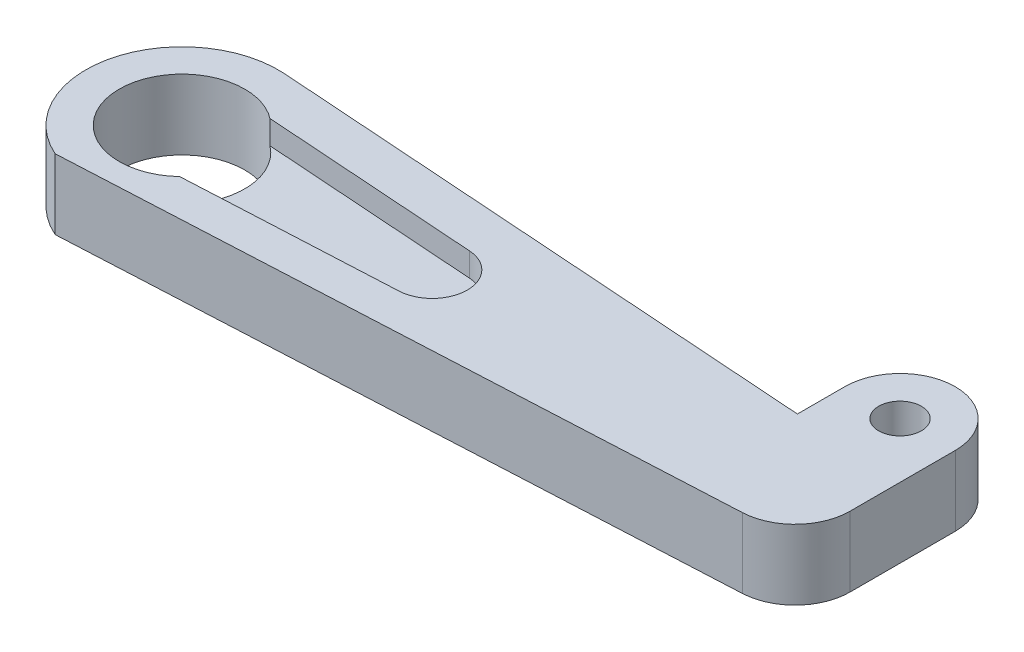
ISO-10303-21;
HEADER;
FILE_DESCRIPTION(('STEP AP214'),'2;1');
FILE_NAME('part.step','',(''),(''),'','','');
FILE_SCHEMA(('AUTOMOTIVE_DESIGN { 1 0 10303 214 1 1 1 1 }'));
ENDSEC;
DATA;
#1=APPLICATION_CONTEXT('core data for automotive mechanical design processes');
#2=APPLICATION_PROTOCOL_DEFINITION('international standard','automotive_design',2000,#1);
#3=PRODUCT_CONTEXT('',#1,'mechanical');
#4=PRODUCT('Part','Part','',(#3));
#5=PRODUCT_RELATED_PRODUCT_CATEGORY('part','',(#4));
#6=PRODUCT_DEFINITION_FORMATION('','',#4);
#7=PRODUCT_DEFINITION_CONTEXT('part definition',#1,'design');
#8=PRODUCT_DEFINITION('design','',#6,#7);
#9=PRODUCT_DEFINITION_SHAPE('','',#8);
#10=(LENGTH_UNIT() NAMED_UNIT(*) SI_UNIT(.MILLI.,.METRE.));
#11=(NAMED_UNIT(*) PLANE_ANGLE_UNIT() SI_UNIT($,.RADIAN.));
#12=(NAMED_UNIT(*) SI_UNIT($,.STERADIAN.) SOLID_ANGLE_UNIT());
#13=UNCERTAINTY_MEASURE_WITH_UNIT(LENGTH_MEASURE(1.E-05),#10,'distance_accuracy_value','');
#14=(GEOMETRIC_REPRESENTATION_CONTEXT(3) GLOBAL_UNCERTAINTY_ASSIGNED_CONTEXT((#13)) GLOBAL_UNIT_ASSIGNED_CONTEXT((#10,
#11,#12)) REPRESENTATION_CONTEXT('',''));
#15=CARTESIAN_POINT('',(0.,0.,0.));
#16=DIRECTION('',(0.,0.,1.));
#17=DIRECTION('',(1.,0.,0.));
#18=AXIS2_PLACEMENT_3D('',#15,#16,#17);
#19=CARTESIAN_POINT('',(0.,4.,0.));
#20=DIRECTION('',(0.,1.,0.));
#21=DIRECTION('',(0.,0.,1.));
#22=AXIS2_PLACEMENT_3D('',#19,#20,#21);
#23=PLANE('',#22);
#24=CARTESIAN_POINT('',(0.,4.,0.));
#25=DIRECTION('',(0.,-1.,0.));
#26=DIRECTION('',(0.,0.,-1.));
#27=AXIS2_PLACEMENT_3D('',#24,#25,#26);
#28=CIRCLE('',#27,3.585);
#29=CARTESIAN_POINT('',(2.46824330243191,4.,2.6));
#30=VERTEX_POINT('',#29);
#31=CARTESIAN_POINT('',(2.17479309360684,4.,-2.85));
#32=VERTEX_POINT('',#31);
#33=EDGE_CURVE('E184',#30,#32,#28,.T.);
#34=ORIENTED_EDGE('',*,*,#33,.T.);
#35=DIRECTION('',(-0.997596457520769,0.,-0.0692914709182375));
#36=VECTOR('',#35,1.);
#37=CARTESIAN_POINT('',(2.17479309360684,4.,-2.85));
#38=LINE('',#37,#36);
#39=CARTESIAN_POINT('',(14.4288371997458,4.,-1.99885349240161));
#40=VERTEX_POINT('',#39);
#41=EDGE_CURVE('E203',#40,#32,#38,.T.);
#42=ORIENTED_EDGE('',*,*,#41,.F.);
#43=CARTESIAN_POINT('',(14.29,4.,0.));
#44=DIRECTION('',(0.,1.,0.));
#45=DIRECTION('',(0.,0.,-1.));
#46=AXIS2_PLACEMENT_3D('',#43,#44,#45);
#47=CIRCLE('',#46,2.00366939691142);
#48=CARTESIAN_POINT('',(14.3905171987579,4.,2.00114650759839));
#49=VERTEX_POINT('',#48);
#50=EDGE_CURVE('E208',#49,#40,#47,.T.);
#51=ORIENTED_EDGE('',*,*,#50,.F.);
#52=DIRECTION('',(0.998740865475654,0.,-0.0501665588708387));
#53=VECTOR('',#52,1.);
#54=CARTESIAN_POINT('',(14.3905171987579,4.,2.00114650759839));
#55=LINE('',#54,#53);
#56=EDGE_CURVE('E211',#30,#49,#55,.T.);
#57=ORIENTED_EDGE('',*,*,#56,.F.);
#58=EDGE_LOOP('',(#34,#42,#51,#57));
#59=FACE_BOUND('',#58,.T.);
#60=CARTESIAN_POINT('',(0.,4.,0.));
#61=DIRECTION('',(0.,1.,0.));
#62=DIRECTION('',(0.,0.,1.));
#63=AXIS2_PLACEMENT_3D('',#60,#61,#62);
#64=CIRCLE('',#63,5.49384451633303);
#65=CARTESIAN_POINT('',(0.380676567532808,4.,-5.48063982766373));
#66=VERTEX_POINT('',#65);
#67=CARTESIAN_POINT('',(-2.21545485276915,4.,5.0273340216246));
#68=VERTEX_POINT('',#67);
#69=EDGE_CURVE('E156',#66,#68,#64,.T.);
#70=ORIENTED_EDGE('',*,*,#69,.T.);
#71=DIRECTION('',(0.998740865475654,0.,-0.0501665588708389));
#72=VECTOR('',#71,1.);
#73=CARTESIAN_POINT('',(35.1582269633634,4.,3.15006127364699));
#74=LINE('',#73,#72);
#75=CARTESIAN_POINT('',(35.1582269633634,4.,3.15006127364699));
#76=VERTEX_POINT('',#75);
#77=EDGE_CURVE('E101',#68,#76,#74,.T.);
#78=ORIENTED_EDGE('',*,*,#77,.T.);
#79=CARTESIAN_POINT('',(35.,4.,0.));
#80=DIRECTION('',(0.,1.,0.));
#81=DIRECTION('',(0.,0.,1.));
#82=AXIS2_PLACEMENT_3D('',#79,#80,#81);
#83=CIRCLE('',#82,3.15403262501606);
#84=CARTESIAN_POINT('',(38.1540326250161,4.,0.));
#85=VERTEX_POINT('',#84);
#86=EDGE_CURVE('E168',#76,#85,#83,.T.);
#87=ORIENTED_EDGE('',*,*,#86,.T.);
#88=DIRECTION('',(0.,0.,-1.));
#89=VECTOR('',#88,1.);
#90=CARTESIAN_POINT('',(38.1540326250161,4.,-6.));
#91=LINE('',#90,#89);
#92=CARTESIAN_POINT('',(38.1540326250161,4.,-6.));
#93=VERTEX_POINT('',#92);
#94=EDGE_CURVE('E120',#85,#93,#91,.T.);
#95=ORIENTED_EDGE('',*,*,#94,.T.);
#96=CARTESIAN_POINT('',(35.,4.,-6.));
#97=DIRECTION('',(0.,1.,0.));
#98=DIRECTION('',(0.,0.,-1.));
#99=AXIS2_PLACEMENT_3D('',#96,#97,#98);
#100=CIRCLE('',#99,3.15403262501605);
#101=CARTESIAN_POINT('',(31.8459673749839,4.,-6.));
#102=VERTEX_POINT('',#101);
#103=EDGE_CURVE('E113',#93,#102,#100,.T.);
#104=ORIENTED_EDGE('',*,*,#103,.T.);
#105=DIRECTION('',(0.,0.,1.));
#106=VECTOR('',#105,1.);
#107=CARTESIAN_POINT('',(31.8459673749839,4.,-3.29511053224421));
#108=LINE('',#107,#106);
#109=CARTESIAN_POINT('',(31.8459673749839,4.,-3.29511053224421));
#110=VERTEX_POINT('',#109);
#111=EDGE_CURVE('E117',#102,#110,#108,.T.);
#112=ORIENTED_EDGE('',*,*,#111,.T.);
#113=DIRECTION('',(-0.997596457520769,0.,-0.0692914709182374));
#114=VECTOR('',#113,1.);
#115=CARTESIAN_POINT('',(0.380676567532808,4.,-5.48063982766373));
#116=LINE('',#115,#114);
#117=EDGE_CURVE('E63',#110,#66,#116,.T.);
#118=ORIENTED_EDGE('',*,*,#117,.T.);
#119=EDGE_LOOP('',(#70,#78,#87,#95,#104,#112,#118));
#120=FACE_BOUND('',#119,.T.);
#121=CARTESIAN_POINT('',(35.,4.,-6.));
#122=DIRECTION('',(0.,1.,0.));
#123=DIRECTION('',(0.,0.,1.));
#124=AXIS2_PLACEMENT_3D('',#121,#122,#123);
#125=CIRCLE('',#124,1.2192);
#126=CARTESIAN_POINT('',(35.,4.,-4.7808));
#127=VERTEX_POINT('',#126);
#128=EDGE_CURVE('E146',#127,#127,#125,.T.);
#129=ORIENTED_EDGE('',*,*,#128,.F.);
#130=EDGE_LOOP('',(#129));
#131=FACE_BOUND('',#130,.T.);
#132=ADVANCED_FACE('F39',(#59,#120,#131),#23,.T.);
#133=CARTESIAN_POINT('',(0.,0.,0.));
#134=DIRECTION('',(0.,1.,0.));
#135=DIRECTION('',(0.,0.,1.));
#136=AXIS2_PLACEMENT_3D('',#133,#134,#135);
#137=PLANE('',#136);
#138=CARTESIAN_POINT('',(0.,0.,0.));
#139=DIRECTION('',(0.,-1.,0.));
#140=DIRECTION('',(0.,0.,-1.));
#141=AXIS2_PLACEMENT_3D('',#138,#139,#140);
#142=CIRCLE('',#141,3.585);
#143=CARTESIAN_POINT('',(0.,0.,-3.585));
#144=VERTEX_POINT('',#143);
#145=EDGE_CURVE('E189',#144,#144,#142,.T.);
#146=ORIENTED_EDGE('',*,*,#145,.F.);
#147=EDGE_LOOP('',(#146));
#148=FACE_BOUND('',#147,.T.);
#149=CARTESIAN_POINT('',(0.,0.,0.));
#150=DIRECTION('',(0.,1.,0.));
#151=DIRECTION('',(0.,0.,1.));
#152=AXIS2_PLACEMENT_3D('',#149,#150,#151);
#153=CIRCLE('',#152,5.49384451633303);
#154=CARTESIAN_POINT('',(0.380676567532808,0.,-5.48063982766373));
#155=VERTEX_POINT('',#154);
#156=CARTESIAN_POINT('',(-2.21545485276915,0.,5.0273340216246));
#157=VERTEX_POINT('',#156);
#158=EDGE_CURVE('E142',#155,#157,#153,.T.);
#159=ORIENTED_EDGE('',*,*,#158,.F.);
#160=DIRECTION('',(-0.997596457520769,0.,-0.0692914709182374));
#161=VECTOR('',#160,1.);
#162=CARTESIAN_POINT('',(0.380676567532808,0.,-5.48063982766373));
#163=LINE('',#162,#161);
#164=CARTESIAN_POINT('',(31.8459673749839,0.,-3.29511053224421));
#165=VERTEX_POINT('',#164);
#166=EDGE_CURVE('E93',#165,#155,#163,.T.);
#167=ORIENTED_EDGE('',*,*,#166,.F.);
#168=DIRECTION('',(0.,0.,1.));
#169=VECTOR('',#168,1.);
#170=CARTESIAN_POINT('',(31.8459673749839,0.,-3.29511053224421));
#171=LINE('',#170,#169);
#172=CARTESIAN_POINT('',(31.8459673749839,0.,-6.));
#173=VERTEX_POINT('',#172);
#174=EDGE_CURVE('E153',#173,#165,#171,.T.);
#175=ORIENTED_EDGE('',*,*,#174,.F.);
#176=CARTESIAN_POINT('',(35.,0.,-6.));
#177=DIRECTION('',(0.,1.,0.));
#178=DIRECTION('',(0.,0.,-1.));
#179=AXIS2_PLACEMENT_3D('',#176,#177,#178);
#180=CIRCLE('',#179,3.15403262501605);
#181=CARTESIAN_POINT('',(38.1540326250161,0.,-6.));
#182=VERTEX_POINT('',#181);
#183=EDGE_CURVE('E129',#182,#173,#180,.T.);
#184=ORIENTED_EDGE('',*,*,#183,.F.);
#185=DIRECTION('',(0.,0.,-1.));
#186=VECTOR('',#185,1.);
#187=CARTESIAN_POINT('',(38.1540326250161,0.,-6.));
#188=LINE('',#187,#186);
#189=CARTESIAN_POINT('',(38.1540326250161,0.,0.));
#190=VERTEX_POINT('',#189);
#191=EDGE_CURVE('E150',#190,#182,#188,.T.);
#192=ORIENTED_EDGE('',*,*,#191,.F.);
#193=CARTESIAN_POINT('',(35.,0.,0.));
#194=DIRECTION('',(0.,1.,0.));
#195=DIRECTION('',(0.,0.,1.));
#196=AXIS2_PLACEMENT_3D('',#193,#194,#195);
#197=CIRCLE('',#196,3.15403262501606);
#198=CARTESIAN_POINT('',(35.1582269633634,0.,3.15006127364699));
#199=VERTEX_POINT('',#198);
#200=EDGE_CURVE('E148',#199,#190,#197,.T.);
#201=ORIENTED_EDGE('',*,*,#200,.F.);
#202=DIRECTION('',(0.998740865475654,0.,-0.0501665588708389));
#203=VECTOR('',#202,1.);
#204=CARTESIAN_POINT('',(35.1582269633634,0.,3.15006127364699));
#205=LINE('',#204,#203);
#206=EDGE_CURVE('E145',#157,#199,#205,.T.);
#207=ORIENTED_EDGE('',*,*,#206,.F.);
#208=EDGE_LOOP('',(#159,#167,#175,#184,#192,#201,#207));
#209=FACE_BOUND('',#208,.T.);
#210=CARTESIAN_POINT('',(35.,0.,-6.));
#211=DIRECTION('',(0.,1.,0.));
#212=DIRECTION('',(0.,0.,1.));
#213=AXIS2_PLACEMENT_3D('',#210,#211,#212);
#214=CIRCLE('',#213,1.2192);
#215=CARTESIAN_POINT('',(35.,0.,-4.7808));
#216=VERTEX_POINT('',#215);
#217=EDGE_CURVE('E181',#216,#216,#214,.T.);
#218=ORIENTED_EDGE('',*,*,#217,.T.);
#219=EDGE_LOOP('',(#218));
#220=FACE_BOUND('',#219,.T.);
#221=ADVANCED_FACE('F172',(#148,#209,#220),#137,.F.);
#222=CARTESIAN_POINT('',(0.,4.,0.));
#223=DIRECTION('',(0.,-1.,0.));
#224=DIRECTION('',(0.,0.,-1.));
#225=AXIS2_PLACEMENT_3D('',#222,#223,#224);
#226=CYLINDRICAL_SURFACE('',#225,5.49384451633303);
#227=ORIENTED_EDGE('',*,*,#158,.T.);
#228=DIRECTION('',(0.,-1.,0.));
#229=VECTOR('',#228,1.);
#230=CARTESIAN_POINT('',(-2.21545485276915,4.,5.0273340216246));
#231=LINE('',#230,#229);
#232=EDGE_CURVE('E11',#68,#157,#231,.T.);
#233=ORIENTED_EDGE('',*,*,#232,.F.);
#234=ORIENTED_EDGE('',*,*,#69,.F.);
#235=DIRECTION('',(0.,-1.,0.));
#236=VECTOR('',#235,1.);
#237=CARTESIAN_POINT('',(0.380676567532808,4.,-5.48063982766373));
#238=LINE('',#237,#236);
#239=EDGE_CURVE('E138',#66,#155,#238,.T.);
#240=ORIENTED_EDGE('',*,*,#239,.T.);
#241=EDGE_LOOP('',(#227,#233,#234,#240));
#242=FACE_BOUND('',#241,.T.);
#243=ADVANCED_FACE('F41',(#242),#226,.T.);
#244=CARTESIAN_POINT('',(35.1582269633634,4.,3.15006127364699));
#245=DIRECTION('',(-0.0501665588708389,0.,-0.998740865475654));
#246=DIRECTION('',(-0.998740865475654,0.,0.0501665588708389));
#247=AXIS2_PLACEMENT_3D('',#244,#245,#246);
#248=PLANE('',#247);
#249=ORIENTED_EDGE('',*,*,#206,.T.);
#250=DIRECTION('',(0.,-1.,0.));
#251=VECTOR('',#250,1.);
#252=CARTESIAN_POINT('',(35.1582269633634,4.,3.15006127364699));
#253=LINE('',#252,#251);
#254=EDGE_CURVE('E47',#76,#199,#253,.T.);
#255=ORIENTED_EDGE('',*,*,#254,.F.);
#256=ORIENTED_EDGE('',*,*,#77,.F.);
#257=ORIENTED_EDGE('',*,*,#232,.T.);
#258=EDGE_LOOP('',(#249,#255,#256,#257));
#259=FACE_BOUND('',#258,.T.);
#260=ADVANCED_FACE('F277',(#259),#248,.F.);
#261=CARTESIAN_POINT('',(35.,4.,0.));
#262=DIRECTION('',(0.,-1.,0.));
#263=DIRECTION('',(0.,0.,-1.));
#264=AXIS2_PLACEMENT_3D('',#261,#262,#263);
#265=CYLINDRICAL_SURFACE('',#264,3.15403262501606);
#266=ORIENTED_EDGE('',*,*,#200,.T.);
#267=DIRECTION('',(0.,-1.,0.));
#268=VECTOR('',#267,1.);
#269=CARTESIAN_POINT('',(38.1540326250161,4.,0.));
#270=LINE('',#269,#268);
#271=EDGE_CURVE('E160',#85,#190,#270,.T.);
#272=ORIENTED_EDGE('',*,*,#271,.F.);
#273=ORIENTED_EDGE('',*,*,#86,.F.);
#274=ORIENTED_EDGE('',*,*,#254,.T.);
#275=EDGE_LOOP('',(#266,#272,#273,#274));
#276=FACE_BOUND('',#275,.T.);
#277=ADVANCED_FACE('F166',(#276),#265,.T.);
#278=CARTESIAN_POINT('',(38.1540326250161,4.,-6.));
#279=DIRECTION('',(-1.,0.,0.));
#280=DIRECTION('',(0.,0.,1.));
#281=AXIS2_PLACEMENT_3D('',#278,#279,#280);
#282=PLANE('',#281);
#283=ORIENTED_EDGE('',*,*,#191,.T.);
#284=DIRECTION('',(0.,-1.,0.));
#285=VECTOR('',#284,1.);
#286=CARTESIAN_POINT('',(38.1540326250161,4.,-6.));
#287=LINE('',#286,#285);
#288=EDGE_CURVE('E132',#93,#182,#287,.T.);
#289=ORIENTED_EDGE('',*,*,#288,.F.);
#290=ORIENTED_EDGE('',*,*,#94,.F.);
#291=ORIENTED_EDGE('',*,*,#271,.T.);
#292=EDGE_LOOP('',(#283,#289,#290,#291));
#293=FACE_BOUND('',#292,.T.);
#294=ADVANCED_FACE('F175',(#293),#282,.F.);
#295=CARTESIAN_POINT('',(35.,4.,-6.));
#296=DIRECTION('',(0.,-1.,0.));
#297=DIRECTION('',(0.,0.,-1.));
#298=AXIS2_PLACEMENT_3D('',#295,#296,#297);
#299=CYLINDRICAL_SURFACE('',#298,3.15403262501605);
#300=ORIENTED_EDGE('',*,*,#183,.T.);
#301=DIRECTION('',(0.,-1.,0.));
#302=VECTOR('',#301,1.);
#303=CARTESIAN_POINT('',(31.8459673749839,4.,-6.));
#304=LINE('',#303,#302);
#305=EDGE_CURVE('E126',#102,#173,#304,.T.);
#306=ORIENTED_EDGE('',*,*,#305,.F.);
#307=ORIENTED_EDGE('',*,*,#103,.F.);
#308=ORIENTED_EDGE('',*,*,#288,.T.);
#309=EDGE_LOOP('',(#300,#306,#307,#308));
#310=FACE_BOUND('',#309,.T.);
#311=ADVANCED_FACE('F127',(#310),#299,.T.);
#312=CARTESIAN_POINT('',(31.8459673749839,4.,-3.29511053224421));
#313=DIRECTION('',(1.,0.,0.));
#314=DIRECTION('',(0.,0.,-1.));
#315=AXIS2_PLACEMENT_3D('',#312,#313,#314);
#316=PLANE('',#315);
#317=ORIENTED_EDGE('',*,*,#174,.T.);
#318=DIRECTION('',(0.,-1.,0.));
#319=VECTOR('',#318,1.);
#320=CARTESIAN_POINT('',(31.8459673749839,4.,-3.29511053224421));
#321=LINE('',#320,#319);
#322=EDGE_CURVE('E133',#110,#165,#321,.T.);
#323=ORIENTED_EDGE('',*,*,#322,.F.);
#324=ORIENTED_EDGE('',*,*,#111,.F.);
#325=ORIENTED_EDGE('',*,*,#305,.T.);
#326=EDGE_LOOP('',(#317,#323,#324,#325));
#327=FACE_BOUND('',#326,.T.);
#328=ADVANCED_FACE('F135',(#327),#316,.F.);
#329=CARTESIAN_POINT('',(0.380676567532808,4.,-5.48063982766373));
#330=DIRECTION('',(-0.0692914709182374,0.,0.997596457520769));
#331=DIRECTION('',(0.997596457520769,0.,0.0692914709182374));
#332=AXIS2_PLACEMENT_3D('',#329,#330,#331);
#333=PLANE('',#332);
#334=ORIENTED_EDGE('',*,*,#166,.T.);
#335=ORIENTED_EDGE('',*,*,#239,.F.);
#336=ORIENTED_EDGE('',*,*,#117,.F.);
#337=ORIENTED_EDGE('',*,*,#322,.T.);
#338=EDGE_LOOP('',(#334,#335,#336,#337));
#339=FACE_BOUND('',#338,.T.);
#340=ADVANCED_FACE('F267',(#339),#333,.F.);
#341=CARTESIAN_POINT('',(35.,4.,-6.));
#342=DIRECTION('',(0.,-1.,0.));
#343=DIRECTION('',(0.,0.,-1.));
#344=AXIS2_PLACEMENT_3D('',#341,#342,#343);
#345=CYLINDRICAL_SURFACE('',#344,1.2192);
#346=ORIENTED_EDGE('',*,*,#128,.T.);
#347=EDGE_LOOP('',(#346));
#348=FACE_BOUND('',#347,.T.);
#349=ORIENTED_EDGE('',*,*,#217,.F.);
#350=EDGE_LOOP('',(#349));
#351=FACE_BOUND('',#350,.T.);
#352=ADVANCED_FACE('F264',(#348,#351),#345,.F.);
#353=CARTESIAN_POINT('',(0.,2.65,0.));
#354=DIRECTION('',(0.,1.,0.));
#355=DIRECTION('',(0.,0.,1.));
#356=AXIS2_PLACEMENT_3D('',#353,#354,#355);
#357=PLANE('',#356);
#358=CARTESIAN_POINT('',(0.,2.65,0.));
#359=DIRECTION('',(0.,-1.,0.));
#360=DIRECTION('',(0.,0.,1.));
#361=AXIS2_PLACEMENT_3D('',#358,#359,#360);
#362=CIRCLE('',#361,3.585);
#363=CARTESIAN_POINT('',(2.17479309360684,2.65,-2.85));
#364=VERTEX_POINT('',#363);
#365=CARTESIAN_POINT('',(2.46824330243191,2.65,2.6));
#366=VERTEX_POINT('',#365);
#367=EDGE_CURVE('E207',#364,#366,#362,.T.);
#368=ORIENTED_EDGE('',*,*,#367,.T.);
#369=DIRECTION('',(0.998740865475654,0.,-0.0501665588708387));
#370=VECTOR('',#369,1.);
#371=CARTESIAN_POINT('',(14.3905171987579,2.65,2.00114650759839));
#372=LINE('',#371,#370);
#373=CARTESIAN_POINT('',(14.3905171987579,2.65,2.00114650759839));
#374=VERTEX_POINT('',#373);
#375=EDGE_CURVE('E220',#366,#374,#372,.T.);
#376=ORIENTED_EDGE('',*,*,#375,.T.);
#377=CARTESIAN_POINT('',(14.29,2.65,0.));
#378=DIRECTION('',(0.,1.,0.));
#379=DIRECTION('',(0.,0.,-1.));
#380=AXIS2_PLACEMENT_3D('',#377,#378,#379);
#381=CIRCLE('',#380,2.00366939691142);
#382=CARTESIAN_POINT('',(14.4288371997458,2.65,-1.99885349240161));
#383=VERTEX_POINT('',#382);
#384=EDGE_CURVE('E217',#374,#383,#381,.T.);
#385=ORIENTED_EDGE('',*,*,#384,.T.);
#386=DIRECTION('',(-0.997596457520769,0.,-0.0692914709182375));
#387=VECTOR('',#386,1.);
#388=CARTESIAN_POINT('',(2.17479309360684,2.65,-2.85));
#389=LINE('',#388,#387);
#390=EDGE_CURVE('E195',#383,#364,#389,.T.);
#391=ORIENTED_EDGE('',*,*,#390,.T.);
#392=EDGE_LOOP('',(#368,#376,#385,#391));
#393=FACE_BOUND('',#392,.T.);
#394=ADVANCED_FACE('F227',(#393),#357,.T.);
#395=CARTESIAN_POINT('',(0.,0.,0.));
#396=DIRECTION('',(0.,-1.,0.));
#397=DIRECTION('',(0.,0.,-1.));
#398=AXIS2_PLACEMENT_3D('',#395,#396,#397);
#399=CYLINDRICAL_SURFACE('',#398,3.585);
#400=DIRECTION('',(0.,1.,0.));
#401=VECTOR('',#400,1.);
#402=CARTESIAN_POINT('',(2.17479309360684,2.65,-2.85));
#403=LINE('',#402,#401);
#404=EDGE_CURVE('E192',#364,#32,#403,.T.);
#405=ORIENTED_EDGE('',*,*,#404,.T.);
#406=ORIENTED_EDGE('',*,*,#33,.F.);
#407=DIRECTION('',(0.,1.,0.));
#408=VECTOR('',#407,1.);
#409=CARTESIAN_POINT('',(2.46824330243191,2.65,2.6));
#410=LINE('',#409,#408);
#411=EDGE_CURVE('E54',#366,#30,#410,.T.);
#412=ORIENTED_EDGE('',*,*,#411,.F.);
#413=ORIENTED_EDGE('',*,*,#367,.F.);
#414=EDGE_LOOP('',(#405,#406,#412,#413));
#415=FACE_BOUND('',#414,.T.);
#416=ORIENTED_EDGE('',*,*,#145,.T.);
#417=EDGE_LOOP('',(#416));
#418=FACE_BOUND('',#417,.T.);
#419=ADVANCED_FACE('F232',(#415,#418),#399,.F.);
#420=CARTESIAN_POINT('',(14.3905171987579,2.65,2.00114650759839));
#421=DIRECTION('',(0.0501665588708387,0.,0.998740865475654));
#422=DIRECTION('',(0.998740865475654,0.,-0.0501665588708387));
#423=AXIS2_PLACEMENT_3D('',#420,#421,#422);
#424=PLANE('',#423);
#425=ORIENTED_EDGE('',*,*,#56,.T.);
#426=DIRECTION('',(0.,1.,0.));
#427=VECTOR('',#426,1.);
#428=CARTESIAN_POINT('',(14.3905171987579,2.65,2.00114650759839));
#429=LINE('',#428,#427);
#430=EDGE_CURVE('E194',#374,#49,#429,.T.);
#431=ORIENTED_EDGE('',*,*,#430,.F.);
#432=ORIENTED_EDGE('',*,*,#375,.F.);
#433=ORIENTED_EDGE('',*,*,#411,.T.);
#434=EDGE_LOOP('',(#425,#431,#432,#433));
#435=FACE_BOUND('',#434,.T.);
#436=ADVANCED_FACE('F236',(#435),#424,.F.);
#437=CARTESIAN_POINT('',(14.29,2.65,0.));
#438=DIRECTION('',(0.,1.,0.));
#439=DIRECTION('',(0.,0.,1.));
#440=AXIS2_PLACEMENT_3D('',#437,#438,#439);
#441=CYLINDRICAL_SURFACE('',#440,2.00366939691142);
#442=ORIENTED_EDGE('',*,*,#50,.T.);
#443=DIRECTION('',(0.,1.,0.));
#444=VECTOR('',#443,1.);
#445=CARTESIAN_POINT('',(14.4288371997458,2.65,-1.99885349240161));
#446=LINE('',#445,#444);
#447=EDGE_CURVE('E198',#383,#40,#446,.T.);
#448=ORIENTED_EDGE('',*,*,#447,.F.);
#449=ORIENTED_EDGE('',*,*,#384,.F.);
#450=ORIENTED_EDGE('',*,*,#430,.T.);
#451=EDGE_LOOP('',(#442,#448,#449,#450));
#452=FACE_BOUND('',#451,.T.);
#453=ADVANCED_FACE('F245',(#452),#441,.F.);
#454=CARTESIAN_POINT('',(2.17479309360684,2.65,-2.85));
#455=DIRECTION('',(0.0692914709182375,0.,-0.997596457520769));
#456=DIRECTION('',(-0.997596457520769,0.,-0.0692914709182375));
#457=AXIS2_PLACEMENT_3D('',#454,#455,#456);
#458=PLANE('',#457);
#459=ORIENTED_EDGE('',*,*,#41,.T.);
#460=ORIENTED_EDGE('',*,*,#404,.F.);
#461=ORIENTED_EDGE('',*,*,#390,.F.);
#462=ORIENTED_EDGE('',*,*,#447,.T.);
#463=EDGE_LOOP('',(#459,#460,#461,#462));
#464=FACE_BOUND('',#463,.T.);
#465=ADVANCED_FACE('F250',(#464),#458,.F.);
#466=CLOSED_SHELL('',(#132,#221,#243,#260,#277,#294,#311,#328,#340,#352,#394,#419,#436,#453,#465));
#467=MANIFOLD_SOLID_BREP('B2',#466);
#468=ADVANCED_BREP_SHAPE_REPRESENTATION('',(#18,#467),#14);
#469=SHAPE_DEFINITION_REPRESENTATION(#9,#468);
ENDSEC;
END-ISO-10303-21;
